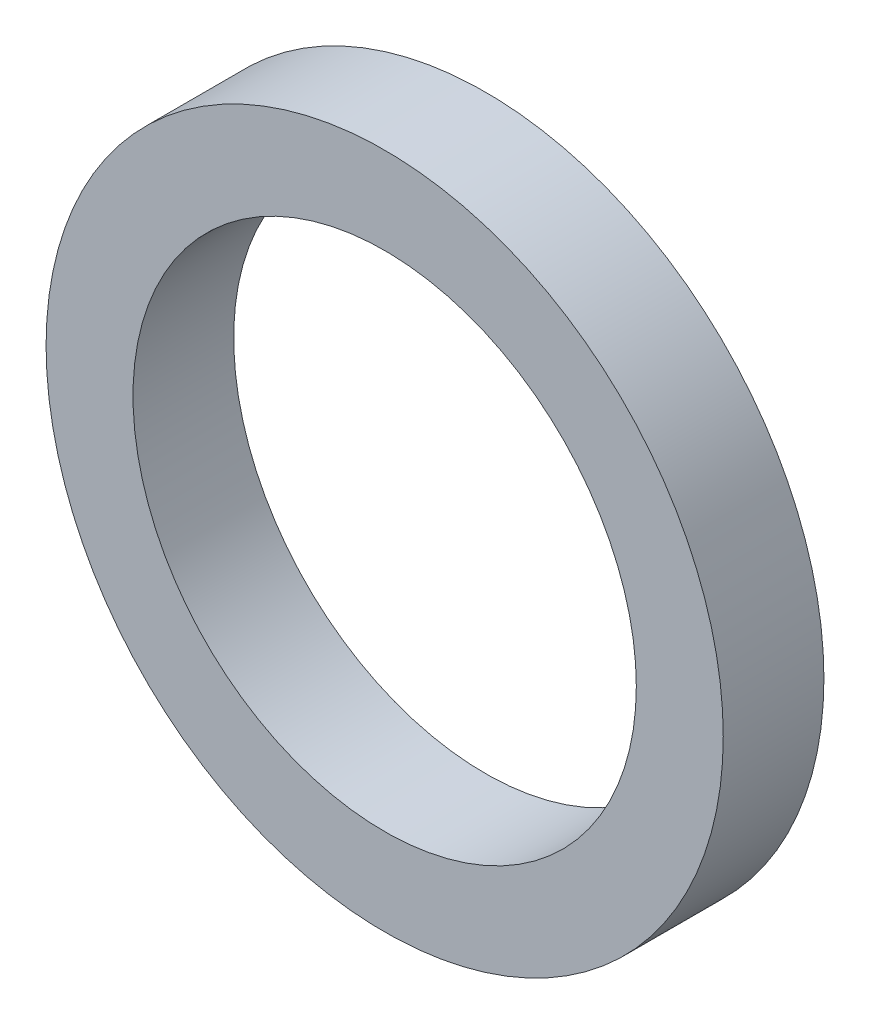
ISO-10303-21;
HEADER;
FILE_DESCRIPTION(('STEP AP214'),'2;1');
FILE_NAME('part.step','',(''),(''),'','','');
FILE_SCHEMA(('AUTOMOTIVE_DESIGN { 1 0 10303 214 1 1 1 1 }'));
ENDSEC;
DATA;
#1=APPLICATION_CONTEXT('core data for automotive mechanical design processes');
#2=APPLICATION_PROTOCOL_DEFINITION('international standard','automotive_design',2000,#1);
#3=PRODUCT_CONTEXT('',#1,'mechanical');
#4=PRODUCT('Part','Part','',(#3));
#5=PRODUCT_RELATED_PRODUCT_CATEGORY('part','',(#4));
#6=PRODUCT_DEFINITION_FORMATION('','',#4);
#7=PRODUCT_DEFINITION_CONTEXT('part definition',#1,'design');
#8=PRODUCT_DEFINITION('design','',#6,#7);
#9=PRODUCT_DEFINITION_SHAPE('','',#8);
#10=(LENGTH_UNIT() NAMED_UNIT(*) SI_UNIT(.MILLI.,.METRE.));
#11=(NAMED_UNIT(*) PLANE_ANGLE_UNIT() SI_UNIT($,.RADIAN.));
#12=(NAMED_UNIT(*) SI_UNIT($,.STERADIAN.) SOLID_ANGLE_UNIT());
#13=UNCERTAINTY_MEASURE_WITH_UNIT(LENGTH_MEASURE(1.E-05),#10,'distance_accuracy_value','');
#14=(GEOMETRIC_REPRESENTATION_CONTEXT(3) GLOBAL_UNCERTAINTY_ASSIGNED_CONTEXT((#13)) GLOBAL_UNIT_ASSIGNED_CONTEXT((#10,
#11,#12)) REPRESENTATION_CONTEXT('',''));
#15=CARTESIAN_POINT('',(0.,0.,0.));
#16=DIRECTION('',(0.,0.,1.));
#17=DIRECTION('',(1.,0.,0.));
#18=AXIS2_PLACEMENT_3D('',#15,#16,#17);
#19=CARTESIAN_POINT('',(-21.15,-21.15,6.985));
#20=DIRECTION('',(0.,0.,1.));
#21=DIRECTION('',(1.,0.,0.));
#22=AXIS2_PLACEMENT_3D('',#19,#20,#21);
#23=PLANE('',#22);
#24=CARTESIAN_POINT('',(-21.15,-21.15,6.985));
#25=DIRECTION('',(0.,0.,1.));
#26=DIRECTION('',(1.,0.,0.));
#27=AXIS2_PLACEMENT_3D('',#24,#25,#26);
#28=CIRCLE('',#27,23.495);
#29=CARTESIAN_POINT('',(2.34500000000005,-21.15,6.985));
#30=VERTEX_POINT('',#29);
#31=EDGE_CURVE('E10',#30,#30,#28,.T.);
#32=ORIENTED_EDGE('',*,*,#31,.T.);
#33=EDGE_LOOP('',(#32));
#34=FACE_BOUND('',#33,.T.);
#35=CARTESIAN_POINT('',(-21.15,-21.15,6.985));
#36=DIRECTION('',(0.,0.,1.));
#37=DIRECTION('',(1.,0.,0.));
#38=AXIS2_PLACEMENT_3D('',#35,#36,#37);
#39=CIRCLE('',#38,17.4625);
#40=CARTESIAN_POINT('',(-3.68749999999996,-21.15,6.985));
#41=VERTEX_POINT('',#40);
#42=EDGE_CURVE('E57',#41,#41,#39,.T.);
#43=ORIENTED_EDGE('',*,*,#42,.F.);
#44=EDGE_LOOP('',(#43));
#45=FACE_BOUND('',#44,.T.);
#46=ADVANCED_FACE('F43',(#34,#45),#23,.T.);
#47=CARTESIAN_POINT('',(-21.15,-21.15,0.));
#48=DIRECTION('',(0.,0.,1.));
#49=DIRECTION('',(1.,0.,0.));
#50=AXIS2_PLACEMENT_3D('',#47,#48,#49);
#51=PLANE('',#50);
#52=CARTESIAN_POINT('',(-21.15,-21.15,0.));
#53=DIRECTION('',(0.,0.,1.));
#54=DIRECTION('',(1.,0.,0.));
#55=AXIS2_PLACEMENT_3D('',#52,#53,#54);
#56=CIRCLE('',#55,23.495);
#57=CARTESIAN_POINT('',(2.34500000000005,-21.15,0.));
#58=VERTEX_POINT('',#57);
#59=EDGE_CURVE('E50',#58,#58,#56,.T.);
#60=ORIENTED_EDGE('',*,*,#59,.F.);
#61=EDGE_LOOP('',(#60));
#62=FACE_BOUND('',#61,.T.);
#63=CARTESIAN_POINT('',(-21.15,-21.15,0.));
#64=DIRECTION('',(0.,0.,1.));
#65=DIRECTION('',(1.,0.,0.));
#66=AXIS2_PLACEMENT_3D('',#63,#64,#65);
#67=CIRCLE('',#66,17.4625);
#68=CARTESIAN_POINT('',(-3.68749999999996,-21.15,0.));
#69=VERTEX_POINT('',#68);
#70=EDGE_CURVE('E59',#69,#69,#67,.T.);
#71=ORIENTED_EDGE('',*,*,#70,.T.);
#72=EDGE_LOOP('',(#71));
#73=FACE_BOUND('',#72,.T.);
#74=ADVANCED_FACE('F68',(#62,#73),#51,.F.);
#75=CARTESIAN_POINT('',(-21.15,-21.15,6.985));
#76=DIRECTION('',(0.,0.,-1.));
#77=DIRECTION('',(-1.,0.,0.));
#78=AXIS2_PLACEMENT_3D('',#75,#76,#77);
#79=CYLINDRICAL_SURFACE('',#78,23.495);
#80=ORIENTED_EDGE('',*,*,#31,.F.);
#81=EDGE_LOOP('',(#80));
#82=FACE_BOUND('',#81,.T.);
#83=ORIENTED_EDGE('',*,*,#59,.T.);
#84=EDGE_LOOP('',(#83));
#85=FACE_BOUND('',#84,.T.);
#86=ADVANCED_FACE('F44',(#82,#85),#79,.T.);
#87=CARTESIAN_POINT('',(-21.15,-21.15,6.985));
#88=DIRECTION('',(0.,0.,-1.));
#89=DIRECTION('',(-1.,0.,0.));
#90=AXIS2_PLACEMENT_3D('',#87,#88,#89);
#91=CYLINDRICAL_SURFACE('',#90,17.4625);
#92=ORIENTED_EDGE('',*,*,#42,.T.);
#93=EDGE_LOOP('',(#92));
#94=FACE_BOUND('',#93,.T.);
#95=ORIENTED_EDGE('',*,*,#70,.F.);
#96=EDGE_LOOP('',(#95));
#97=FACE_BOUND('',#96,.T.);
#98=ADVANCED_FACE('F67',(#94,#97),#91,.F.);
#99=CLOSED_SHELL('',(#46,#74,#86,#98));
#100=MANIFOLD_SOLID_BREP('B2',#99);
#101=ADVANCED_BREP_SHAPE_REPRESENTATION('',(#18,#100),#14);
#102=SHAPE_DEFINITION_REPRESENTATION(#9,#101);
ENDSEC;
END-ISO-10303-21;
